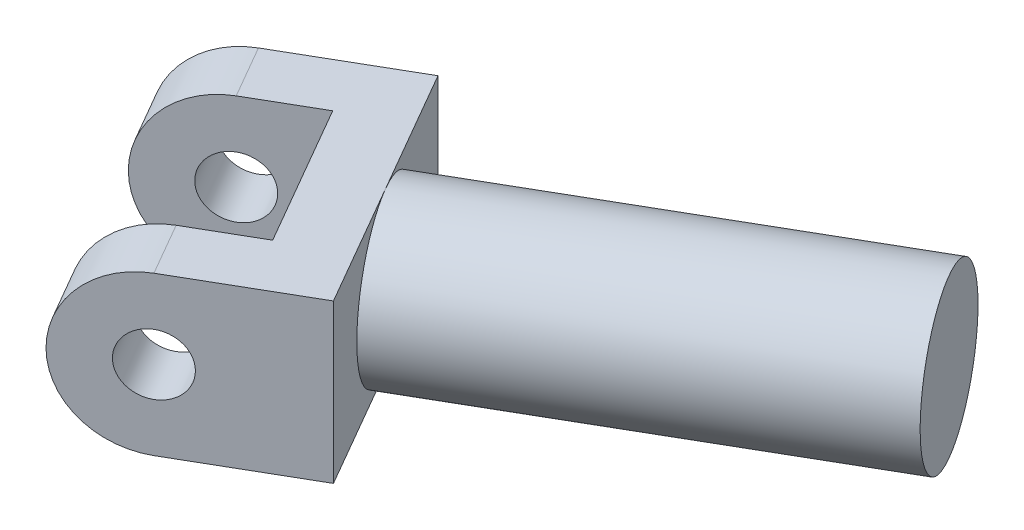
ISO-10303-21;
HEADER;
FILE_DESCRIPTION(('STEP AP214'),'2;1');
FILE_NAME('part.step','',(''),(''),'','','');
FILE_SCHEMA(('AUTOMOTIVE_DESIGN { 1 0 10303 214 1 1 1 1 }'));
ENDSEC;
DATA;
#1=APPLICATION_CONTEXT('core data for automotive mechanical design processes');
#2=APPLICATION_PROTOCOL_DEFINITION('international standard','automotive_design',2000,#1);
#3=PRODUCT_CONTEXT('',#1,'mechanical');
#4=PRODUCT('Part','Part','',(#3));
#5=PRODUCT_RELATED_PRODUCT_CATEGORY('part','',(#4));
#6=PRODUCT_DEFINITION_FORMATION('','',#4);
#7=PRODUCT_DEFINITION_CONTEXT('part definition',#1,'design');
#8=PRODUCT_DEFINITION('design','',#6,#7);
#9=PRODUCT_DEFINITION_SHAPE('','',#8);
#10=(LENGTH_UNIT() NAMED_UNIT(*) SI_UNIT(.MILLI.,.METRE.));
#11=(NAMED_UNIT(*) PLANE_ANGLE_UNIT() SI_UNIT($,.RADIAN.));
#12=(NAMED_UNIT(*) SI_UNIT($,.STERADIAN.) SOLID_ANGLE_UNIT());
#13=UNCERTAINTY_MEASURE_WITH_UNIT(LENGTH_MEASURE(1.E-05),#10,'distance_accuracy_value','');
#14=(GEOMETRIC_REPRESENTATION_CONTEXT(3) GLOBAL_UNCERTAINTY_ASSIGNED_CONTEXT((#13)) GLOBAL_UNIT_ASSIGNED_CONTEXT((#10,
#11,#12)) REPRESENTATION_CONTEXT('',''));
#15=CARTESIAN_POINT('',(0.,0.,0.));
#16=DIRECTION('',(0.,0.,1.));
#17=DIRECTION('',(1.,0.,0.));
#18=AXIS2_PLACEMENT_3D('',#15,#16,#17);
#19=CARTESIAN_POINT('',(-23.625,0.,-40.9197003288147));
#20=DIRECTION('',(-0.5,0.,-0.866025403784439));
#21=DIRECTION('',(0.866025403784439,0.,-0.5));
#22=AXIS2_PLACEMENT_3D('',#19,#20,#21);
#23=PLANE('',#22);
#24=CARTESIAN_POINT('',(-23.625,0.,-40.9197003288147));
#25=DIRECTION('',(-0.5,0.,-0.866025403784439));
#26=DIRECTION('',(0.866025403784439,0.,-0.5));
#27=AXIS2_PLACEMENT_3D('',#24,#25,#26);
#28=CIRCLE('',#27,17.5);
#29=CARTESIAN_POINT('',(-8.46955543377237,0.,-49.6697003288147));
#30=VERTEX_POINT('',#29);
#31=EDGE_CURVE('E197',#30,#30,#28,.T.);
#32=ORIENTED_EDGE('',*,*,#31,.T.);
#33=EDGE_LOOP('',(#32));
#34=FACE_BOUND('',#33,.T.);
#35=DIRECTION('',(0.,-1.,0.));
#36=VECTOR('',#35,1.);
#37=CARTESIAN_POINT('',(11.6152102105664,0.,-61.2656451801843));
#38=LINE('',#37,#36);
#39=CARTESIAN_POINT('',(11.6152102105664,45.5,-61.2656451801843));
#40=VERTEX_POINT('',#39);
#41=CARTESIAN_POINT('',(11.6152102105663,-45.5,-61.2656451801843));
#42=VERTEX_POINT('',#41);
#43=EDGE_CURVE('E64',#40,#42,#38,.T.);
#44=ORIENTED_EDGE('',*,*,#43,.F.);
#45=DIRECTION('',(0.866025403784439,0.,-0.5));
#46=VECTOR('',#45,1.);
#47=CARTESIAN_POINT('',(-23.625,45.5,-40.9197003288147));
#48=LINE('',#47,#46);
#49=CARTESIAN_POINT('',(-23.625,45.5,-40.9197003288147));
#50=VERTEX_POINT('',#49);
#51=EDGE_CURVE('E220',#50,#40,#48,.T.);
#52=ORIENTED_EDGE('',*,*,#51,.F.);
#53=CARTESIAN_POINT('',(-23.625,0.,-40.9197003288147));
#54=DIRECTION('',(-0.5,0.,-0.866025403784439));
#55=DIRECTION('',(0.866025403784439,0.,-0.5));
#56=AXIS2_PLACEMENT_3D('',#53,#54,#55);
#57=CIRCLE('',#56,45.5);
#58=CARTESIAN_POINT('',(-23.625,-45.5,-40.9197003288147));
#59=VERTEX_POINT('',#58);
#60=EDGE_CURVE('E202',#59,#50,#57,.T.);
#61=ORIENTED_EDGE('',*,*,#60,.F.);
#62=DIRECTION('',(-0.866025403784439,0.,0.5));
#63=VECTOR('',#62,1.);
#64=CARTESIAN_POINT('',(-23.625,-45.5,-40.9197003288147));
#65=LINE('',#64,#63);
#66=EDGE_CURVE('E86',#42,#59,#65,.T.);
#67=ORIENTED_EDGE('',*,*,#66,.F.);
#68=EDGE_LOOP('',(#44,#52,#61,#67));
#69=FACE_BOUND('',#68,.T.);
#70=ADVANCED_FACE('F48',(#34,#69),#23,.F.);
#71=CARTESIAN_POINT('',(-41.125,0.,-71.2305894612701));
#72=DIRECTION('',(-0.5,0.,-0.866025403784439));
#73=DIRECTION('',(0.866025403784439,0.,-0.5));
#74=AXIS2_PLACEMENT_3D('',#71,#72,#73);
#75=PLANE('',#74);
#76=DIRECTION('',(0.866025403784439,0.,-0.5));
#77=VECTOR('',#76,1.);
#78=CARTESIAN_POINT('',(-41.125,45.5,-71.2305894612701));
#79=LINE('',#78,#77);
#80=CARTESIAN_POINT('',(-41.125,45.5,-71.2305894612701));
#81=VERTEX_POINT('',#80);
#82=CARTESIAN_POINT('',(24.4260993430217,45.5,-109.07653431264));
#83=VERTEX_POINT('',#82);
#84=EDGE_CURVE('E93',#81,#83,#79,.T.);
#85=ORIENTED_EDGE('',*,*,#84,.T.);
#86=DIRECTION('',(0.,-1.,0.));
#87=VECTOR('',#86,1.);
#88=CARTESIAN_POINT('',(24.4260993430217,-45.5,-109.07653431264));
#89=LINE('',#88,#87);
#90=CARTESIAN_POINT('',(24.4260993430217,-45.5,-109.07653431264));
#91=VERTEX_POINT('',#90);
#92=EDGE_CURVE('E211',#83,#91,#89,.T.);
#93=ORIENTED_EDGE('',*,*,#92,.T.);
#94=DIRECTION('',(-0.866025403784439,0.,0.5));
#95=VECTOR('',#94,1.);
#96=CARTESIAN_POINT('',(-41.125,-45.5,-71.2305894612701));
#97=LINE('',#96,#95);
#98=CARTESIAN_POINT('',(-41.125,-45.5,-71.2305894612701));
#99=VERTEX_POINT('',#98);
#100=EDGE_CURVE('E73',#91,#99,#97,.T.);
#101=ORIENTED_EDGE('',*,*,#100,.T.);
#102=CARTESIAN_POINT('',(-41.125,0.,-71.2305894612701));
#103=DIRECTION('',(-0.5,0.,-0.866025403784439));
#104=DIRECTION('',(0.866025403784439,0.,-0.5));
#105=AXIS2_PLACEMENT_3D('',#102,#103,#104);
#106=CIRCLE('',#105,45.5);
#107=EDGE_CURVE('E206',#99,#81,#106,.T.);
#108=ORIENTED_EDGE('',*,*,#107,.T.);
#109=EDGE_LOOP('',(#85,#93,#101,#108));
#110=FACE_BOUND('',#109,.T.);
#111=CARTESIAN_POINT('',(-41.125,0.,-71.2305894612701));
#112=DIRECTION('',(-0.5,0.,-0.866025403784439));
#113=DIRECTION('',(0.866025403784439,0.,-0.5));
#114=AXIS2_PLACEMENT_3D('',#111,#112,#113);
#115=CIRCLE('',#114,17.5);
#116=CARTESIAN_POINT('',(-25.9695554337724,0.,-79.9805894612701));
#117=VERTEX_POINT('',#116);
#118=EDGE_CURVE('E198',#117,#117,#115,.T.);
#119=ORIENTED_EDGE('',*,*,#118,.F.);
#120=EDGE_LOOP('',(#119));
#121=FACE_BOUND('',#120,.T.);
#122=ADVANCED_FACE('F258',(#110,#121),#75,.T.);
#123=CARTESIAN_POINT('',(-41.125,0.,-71.2305894612701));
#124=DIRECTION('',(0.5,0.,0.866025403784439));
#125=DIRECTION('',(-0.866025403784439,0.,0.5));
#126=AXIS2_PLACEMENT_3D('',#123,#124,#125);
#127=CYLINDRICAL_SURFACE('',#126,45.5);
#128=ORIENTED_EDGE('',*,*,#60,.T.);
#129=DIRECTION('',(0.5,0.,0.866025403784439));
#130=VECTOR('',#129,1.);
#131=CARTESIAN_POINT('',(-41.125,45.5,-71.2305894612701));
#132=LINE('',#131,#130);
#133=EDGE_CURVE('E12',#81,#50,#132,.T.);
#134=ORIENTED_EDGE('',*,*,#133,.F.);
#135=ORIENTED_EDGE('',*,*,#107,.F.);
#136=DIRECTION('',(0.5,0.,0.866025403784439));
#137=VECTOR('',#136,1.);
#138=CARTESIAN_POINT('',(-41.125,-45.5,-71.2305894612701));
#139=LINE('',#138,#137);
#140=EDGE_CURVE('E216',#99,#59,#139,.T.);
#141=ORIENTED_EDGE('',*,*,#140,.T.);
#142=EDGE_LOOP('',(#128,#134,#135,#141));
#143=FACE_BOUND('',#142,.T.);
#144=ADVANCED_FACE('F50',(#143),#127,.T.);
#145=CARTESIAN_POINT('',(-41.125,45.5,-71.2305894612701));
#146=DIRECTION('',(0.,-1.,0.));
#147=DIRECTION('',(-0.5,0.,0.866025403784439));
#148=AXIS2_PLACEMENT_3D('',#145,#146,#147);
#149=PLANE('',#148);
#150=DIRECTION('',(0.5,0.,0.866025403784439));
#151=VECTOR('',#150,1.);
#152=CARTESIAN_POINT('',(24.4260993430217,45.5,-109.07653431264));
#153=LINE('',#152,#151);
#154=CARTESIAN_POINT('',(65.5510993430218,45.5,-37.8459448513695));
#155=VERTEX_POINT('',#154);
#156=EDGE_CURVE('E57',#83,#155,#153,.T.);
#157=ORIENTED_EDGE('',*,*,#156,.F.);
#158=ORIENTED_EDGE('',*,*,#84,.F.);
#159=ORIENTED_EDGE('',*,*,#133,.T.);
#160=ORIENTED_EDGE('',*,*,#51,.T.);
#161=DIRECTION('',(0.5,0.,0.866025403784438));
#162=VECTOR('',#161,1.);
#163=CARTESIAN_POINT('',(76.3652102105664,45.5,50.8846446099005));
#164=LINE('',#163,#162);
#165=CARTESIAN_POINT('',(58.8652102105664,45.5,20.5737554774452));
#166=VERTEX_POINT('',#165);
#167=EDGE_CURVE('E141',#40,#166,#164,.T.);
#168=ORIENTED_EDGE('',*,*,#167,.T.);
#169=DIRECTION('',(-0.866025403784438,0.,0.5));
#170=VECTOR('',#169,1.);
#171=CARTESIAN_POINT('',(23.625,45.5,40.9197003288147));
#172=LINE('',#171,#170);
#173=CARTESIAN_POINT('',(23.625,45.5,40.9197003288147));
#174=VERTEX_POINT('',#173);
#175=EDGE_CURVE('E153',#166,#174,#172,.T.);
#176=ORIENTED_EDGE('',*,*,#175,.T.);
#177=DIRECTION('',(-0.5,0.,-0.866025403784438));
#178=VECTOR('',#177,1.);
#179=CARTESIAN_POINT('',(41.125,45.5,71.2305894612701));
#180=LINE('',#179,#178);
#181=CARTESIAN_POINT('',(41.125,45.5,71.2305894612701));
#182=VERTEX_POINT('',#181);
#183=EDGE_CURVE('E152',#182,#174,#180,.T.);
#184=ORIENTED_EDGE('',*,*,#183,.F.);
#185=DIRECTION('',(0.866025403784438,0.,-0.5));
#186=VECTOR('',#185,1.);
#187=CARTESIAN_POINT('',(76.3652102105664,45.5,50.8846446099005));
#188=LINE('',#187,#186);
#189=CARTESIAN_POINT('',(106.676099343022,45.5,33.3846446099005));
#190=VERTEX_POINT('',#189);
#191=EDGE_CURVE('E140',#182,#190,#188,.T.);
#192=ORIENTED_EDGE('',*,*,#191,.T.);
#193=DIRECTION('',(0.5,0.,0.866025403784438));
#194=VECTOR('',#193,1.);
#195=CARTESIAN_POINT('',(106.676099343022,45.5,33.3846446099005));
#196=LINE('',#195,#194);
#197=EDGE_CURVE('E180',#155,#190,#196,.T.);
#198=ORIENTED_EDGE('',*,*,#197,.F.);
#199=EDGE_LOOP('',(#157,#158,#159,#160,#168,#176,#184,#192,#198));
#200=FACE_BOUND('',#199,.T.);
#201=ADVANCED_FACE('F238',(#200),#149,.F.);
#202=CARTESIAN_POINT('',(24.4260993430217,-45.5,-109.07653431264));
#203=DIRECTION('',(-0.866025403784439,0.,0.5));
#204=DIRECTION('',(-0.5,0.,-0.866025403784439));
#205=AXIS2_PLACEMENT_3D('',#202,#203,#204);
#206=PLANE('',#205);
#207=ORIENTED_EDGE('',*,*,#156,.T.);
#208=CARTESIAN_POINT('',(65.5510993430219,0.,-37.8459448513695));
#209=DIRECTION('',(0.866025403784438,0.,-0.5));
#210=DIRECTION('',(-0.5,0.,-0.866025403784439));
#211=AXIS2_PLACEMENT_3D('',#208,#209,#210);
#212=CIRCLE('',#211,45.5);
#213=CARTESIAN_POINT('',(65.5510993430218,-45.5,-37.8459448513694));
#214=VERTEX_POINT('',#213);
#215=EDGE_CURVE('E159',#214,#155,#212,.T.);
#216=ORIENTED_EDGE('',*,*,#215,.F.);
#217=DIRECTION('',(0.5,0.,0.866025403784439));
#218=VECTOR('',#217,1.);
#219=CARTESIAN_POINT('',(24.4260993430217,-45.5,-109.07653431264));
#220=LINE('',#219,#218);
#221=EDGE_CURVE('E227',#91,#214,#220,.T.);
#222=ORIENTED_EDGE('',*,*,#221,.F.);
#223=ORIENTED_EDGE('',*,*,#92,.F.);
#224=EDGE_LOOP('',(#207,#216,#222,#223));
#225=FACE_BOUND('',#224,.T.);
#226=ADVANCED_FACE('F235',(#225),#206,.F.);
#227=CARTESIAN_POINT('',(-41.125,-45.5,-71.2305894612701));
#228=DIRECTION('',(0.,1.,0.));
#229=DIRECTION('',(0.5,0.,-0.866025403784439));
#230=AXIS2_PLACEMENT_3D('',#227,#228,#229);
#231=PLANE('',#230);
#232=ORIENTED_EDGE('',*,*,#221,.T.);
#233=DIRECTION('',(-0.5,0.,-0.866025403784438));
#234=VECTOR('',#233,1.);
#235=CARTESIAN_POINT('',(106.676099343022,-45.5,33.3846446099005));
#236=LINE('',#235,#234);
#237=CARTESIAN_POINT('',(106.676099343022,-45.5,33.3846446099005));
#238=VERTEX_POINT('',#237);
#239=EDGE_CURVE('E135',#238,#214,#236,.T.);
#240=ORIENTED_EDGE('',*,*,#239,.F.);
#241=DIRECTION('',(0.866025403784438,0.,-0.5));
#242=VECTOR('',#241,1.);
#243=CARTESIAN_POINT('',(76.3652102105664,-45.5,50.8846446099005));
#244=LINE('',#243,#242);
#245=CARTESIAN_POINT('',(41.125,-45.5,71.2305894612701));
#246=VERTEX_POINT('',#245);
#247=EDGE_CURVE('E127',#246,#238,#244,.T.);
#248=ORIENTED_EDGE('',*,*,#247,.F.);
#249=DIRECTION('',(-0.5,0.,-0.866025403784438));
#250=VECTOR('',#249,1.);
#251=CARTESIAN_POINT('',(41.125,-45.5,71.2305894612701));
#252=LINE('',#251,#250);
#253=CARTESIAN_POINT('',(23.625,-45.5,40.9197003288147));
#254=VERTEX_POINT('',#253);
#255=EDGE_CURVE('E132',#246,#254,#252,.T.);
#256=ORIENTED_EDGE('',*,*,#255,.T.);
#257=DIRECTION('',(0.866025403784438,0.,-0.5));
#258=VECTOR('',#257,1.);
#259=CARTESIAN_POINT('',(23.625,-45.5,40.9197003288147));
#260=LINE('',#259,#258);
#261=CARTESIAN_POINT('',(58.8652102105664,-45.5,20.5737554774452));
#262=VERTEX_POINT('',#261);
#263=EDGE_CURVE('E288',#254,#262,#260,.T.);
#264=ORIENTED_EDGE('',*,*,#263,.T.);
#265=DIRECTION('',(-0.5,0.,-0.866025403784438));
#266=VECTOR('',#265,1.);
#267=CARTESIAN_POINT('',(76.3652102105664,-45.5,50.8846446099005));
#268=LINE('',#267,#266);
#269=EDGE_CURVE('E177',#262,#42,#268,.T.);
#270=ORIENTED_EDGE('',*,*,#269,.T.);
#271=ORIENTED_EDGE('',*,*,#66,.T.);
#272=ORIENTED_EDGE('',*,*,#140,.F.);
#273=ORIENTED_EDGE('',*,*,#100,.F.);
#274=EDGE_LOOP('',(#232,#240,#248,#256,#264,#270,#271,#272,#273));
#275=FACE_BOUND('',#274,.T.);
#276=ADVANCED_FACE('F129',(#275),#231,.F.);
#277=CARTESIAN_POINT('',(-41.125,0.,-71.2305894612701));
#278=DIRECTION('',(0.5,0.,0.866025403784439));
#279=DIRECTION('',(-0.866025403784439,0.,0.5));
#280=AXIS2_PLACEMENT_3D('',#277,#278,#279);
#281=CYLINDRICAL_SURFACE('',#280,17.5);
#282=ORIENTED_EDGE('',*,*,#118,.T.);
#283=EDGE_LOOP('',(#282));
#284=FACE_BOUND('',#283,.T.);
#285=ORIENTED_EDGE('',*,*,#31,.F.);
#286=EDGE_LOOP('',(#285));
#287=FACE_BOUND('',#286,.T.);
#288=ADVANCED_FACE('F269',(#284,#287),#281,.F.);
#289=CARTESIAN_POINT('',(35.2402102105664,0.,-20.3459448513695));
#290=DIRECTION('',(0.866025403784438,0.,-0.5));
#291=DIRECTION('',(-0.5,0.,-0.866025403784438));
#292=AXIS2_PLACEMENT_3D('',#289,#290,#291);
#293=PLANE('',#292);
#294=ORIENTED_EDGE('',*,*,#167,.F.);
#295=ORIENTED_EDGE('',*,*,#43,.T.);
#296=ORIENTED_EDGE('',*,*,#269,.F.);
#297=DIRECTION('',(0.,-1.,0.));
#298=VECTOR('',#297,1.);
#299=CARTESIAN_POINT('',(58.8652102105664,0.,20.5737554774452));
#300=LINE('',#299,#298);
#301=EDGE_CURVE('E190',#166,#262,#300,.T.);
#302=ORIENTED_EDGE('',*,*,#301,.F.);
#303=EDGE_LOOP('',(#294,#295,#296,#302));
#304=FACE_BOUND('',#303,.T.);
#305=ADVANCED_FACE('F284',(#304),#293,.F.);
#306=CARTESIAN_POINT('',(65.5510993430217,0.,-37.8459448513695));
#307=DIRECTION('',(0.866025403784438,0.,-0.5));
#308=DIRECTION('',(-0.5,0.,-0.866025403784438));
#309=AXIS2_PLACEMENT_3D('',#306,#307,#308);
#310=PLANE('',#309);
#311=ORIENTED_EDGE('',*,*,#197,.T.);
#312=DIRECTION('',(0.,-1.,0.));
#313=VECTOR('',#312,1.);
#314=CARTESIAN_POINT('',(106.676099343022,45.5,33.3846446099005));
#315=LINE('',#314,#313);
#316=EDGE_CURVE('E173',#190,#238,#315,.T.);
#317=ORIENTED_EDGE('',*,*,#316,.T.);
#318=ORIENTED_EDGE('',*,*,#239,.T.);
#319=EDGE_CURVE('E165',#155,#214,#212,.T.);
#320=ORIENTED_EDGE('',*,*,#319,.F.);
#321=EDGE_LOOP('',(#311,#317,#318,#320));
#322=FACE_BOUND('',#321,.T.);
#323=ADVANCED_FACE('F240',(#322),#310,.T.);
#324=CARTESIAN_POINT('',(76.3652102105664,45.5,50.8846446099005));
#325=DIRECTION('',(0.5,0.,0.866025403784438));
#326=DIRECTION('',(0.866025403784438,0.,-0.5));
#327=AXIS2_PLACEMENT_3D('',#324,#325,#326);
#328=PLANE('',#327);
#329=ORIENTED_EDGE('',*,*,#316,.F.);
#330=ORIENTED_EDGE('',*,*,#191,.F.);
#331=CARTESIAN_POINT('',(41.125,0.,71.2305894612701));
#332=DIRECTION('',(0.5,0.,0.866025403784438));
#333=DIRECTION('',(0.866025403784439,0.,-0.5));
#334=AXIS2_PLACEMENT_3D('',#331,#332,#333);
#335=CIRCLE('',#334,45.5);
#336=EDGE_CURVE('E144',#182,#246,#335,.T.);
#337=ORIENTED_EDGE('',*,*,#336,.T.);
#338=ORIENTED_EDGE('',*,*,#247,.T.);
#339=EDGE_LOOP('',(#329,#330,#337,#338));
#340=FACE_BOUND('',#339,.T.);
#341=CARTESIAN_POINT('',(41.125,0.,71.2305894612701));
#342=DIRECTION('',(0.5,0.,0.866025403784438));
#343=DIRECTION('',(0.866025403784439,0.,-0.5));
#344=AXIS2_PLACEMENT_3D('',#341,#342,#343);
#345=CIRCLE('',#344,17.5);
#346=CARTESIAN_POINT('',(56.2804445662277,0.,62.4805894612701));
#347=VERTEX_POINT('',#346);
#348=EDGE_CURVE('E294',#347,#347,#345,.T.);
#349=ORIENTED_EDGE('',*,*,#348,.F.);
#350=EDGE_LOOP('',(#349));
#351=FACE_BOUND('',#350,.T.);
#352=ADVANCED_FACE('F145',(#340,#351),#328,.T.);
#353=CARTESIAN_POINT('',(271.249252674088,0.,-156.60582904887));
#354=DIRECTION('',(-0.866025403784438,0.,0.5));
#355=DIRECTION('',(0.5,0.,0.866025403784439));
#356=AXIS2_PLACEMENT_3D('',#353,#354,#355);
#357=CYLINDRICAL_SURFACE('',#356,45.5);
#358=CARTESIAN_POINT('',(271.249252674088,0.,-156.60582904887));
#359=DIRECTION('',(0.866025403784438,0.,-0.5));
#360=DIRECTION('',(-0.5,0.,-0.866025403784439));
#361=AXIS2_PLACEMENT_3D('',#358,#359,#360);
#362=CIRCLE('',#361,45.5);
#363=CARTESIAN_POINT('',(248.499252674088,0.,-196.009984921062));
#364=VERTEX_POINT('',#363);
#365=EDGE_CURVE('E170',#364,#364,#362,.T.);
#366=ORIENTED_EDGE('',*,*,#365,.F.);
#367=EDGE_LOOP('',(#366));
#368=FACE_BOUND('',#367,.T.);
#369=ORIENTED_EDGE('',*,*,#319,.T.);
#370=ORIENTED_EDGE('',*,*,#215,.T.);
#371=EDGE_LOOP('',(#369,#370));
#372=FACE_BOUND('',#371,.T.);
#373=ADVANCED_FACE('F242',(#368,#372),#357,.T.);
#374=CARTESIAN_POINT('',(271.249252674088,0.,-156.60582904887));
#375=DIRECTION('',(0.866025403784438,0.,-0.5));
#376=DIRECTION('',(-0.5,0.,-0.866025403784439));
#377=AXIS2_PLACEMENT_3D('',#374,#375,#376);
#378=PLANE('',#377);
#379=ORIENTED_EDGE('',*,*,#365,.T.);
#380=EDGE_LOOP('',(#379));
#381=FACE_BOUND('',#380,.T.);
#382=ADVANCED_FACE('F244',(#381),#378,.T.);
#383=CARTESIAN_POINT('',(23.625,0.,40.9197003288147));
#384=DIRECTION('',(0.5,0.,0.866025403784438));
#385=DIRECTION('',(0.866025403784439,0.,-0.5));
#386=AXIS2_PLACEMENT_3D('',#383,#384,#385);
#387=PLANE('',#386);
#388=CARTESIAN_POINT('',(23.625,0.,40.9197003288147));
#389=DIRECTION('',(0.5,0.,0.866025403784438));
#390=DIRECTION('',(0.866025403784439,0.,-0.5));
#391=AXIS2_PLACEMENT_3D('',#388,#389,#390);
#392=CIRCLE('',#391,17.5);
#393=CARTESIAN_POINT('',(38.7804445662277,0.,32.1697003288147));
#394=VERTEX_POINT('',#393);
#395=EDGE_CURVE('E296',#394,#394,#392,.T.);
#396=ORIENTED_EDGE('',*,*,#395,.T.);
#397=EDGE_LOOP('',(#396));
#398=FACE_BOUND('',#397,.T.);
#399=ORIENTED_EDGE('',*,*,#175,.F.);
#400=ORIENTED_EDGE('',*,*,#301,.T.);
#401=ORIENTED_EDGE('',*,*,#263,.F.);
#402=CARTESIAN_POINT('',(23.625,0.,40.9197003288147));
#403=DIRECTION('',(0.5,0.,0.866025403784438));
#404=DIRECTION('',(0.866025403784439,0.,-0.5));
#405=AXIS2_PLACEMENT_3D('',#402,#403,#404);
#406=CIRCLE('',#405,45.5);
#407=EDGE_CURVE('E157',#174,#254,#406,.T.);
#408=ORIENTED_EDGE('',*,*,#407,.F.);
#409=EDGE_LOOP('',(#399,#400,#401,#408));
#410=FACE_BOUND('',#409,.T.);
#411=ADVANCED_FACE('F251',(#398,#410),#387,.F.);
#412=CARTESIAN_POINT('',(41.125,0.,71.2305894612701));
#413=DIRECTION('',(-0.5,0.,-0.866025403784438));
#414=DIRECTION('',(-0.866025403784438,0.,0.5));
#415=AXIS2_PLACEMENT_3D('',#412,#413,#414);
#416=CYLINDRICAL_SURFACE('',#415,45.5);
#417=ORIENTED_EDGE('',*,*,#407,.T.);
#418=ORIENTED_EDGE('',*,*,#255,.F.);
#419=ORIENTED_EDGE('',*,*,#336,.F.);
#420=ORIENTED_EDGE('',*,*,#183,.T.);
#421=EDGE_LOOP('',(#417,#418,#419,#420));
#422=FACE_BOUND('',#421,.T.);
#423=ADVANCED_FACE('F155',(#422),#416,.T.);
#424=CARTESIAN_POINT('',(41.125,0.,71.2305894612701));
#425=DIRECTION('',(-0.5,0.,-0.866025403784438));
#426=DIRECTION('',(-0.866025403784438,0.,0.5));
#427=AXIS2_PLACEMENT_3D('',#424,#425,#426);
#428=CYLINDRICAL_SURFACE('',#427,17.5);
#429=ORIENTED_EDGE('',*,*,#348,.T.);
#430=EDGE_LOOP('',(#429));
#431=FACE_BOUND('',#430,.T.);
#432=ORIENTED_EDGE('',*,*,#395,.F.);
#433=EDGE_LOOP('',(#432));
#434=FACE_BOUND('',#433,.T.);
#435=ADVANCED_FACE('F305',(#431,#434),#428,.F.);
#436=CLOSED_SHELL('',(#70,#122,#144,#201,#226,#276,#288,#305,#323,#352,#373,#382,#411,#423,#435));
#437=MANIFOLD_SOLID_BREP('B2',#436);
#438=ADVANCED_BREP_SHAPE_REPRESENTATION('',(#18,#437),#14);
#439=SHAPE_DEFINITION_REPRESENTATION(#9,#438);
ENDSEC;
END-ISO-10303-21;
